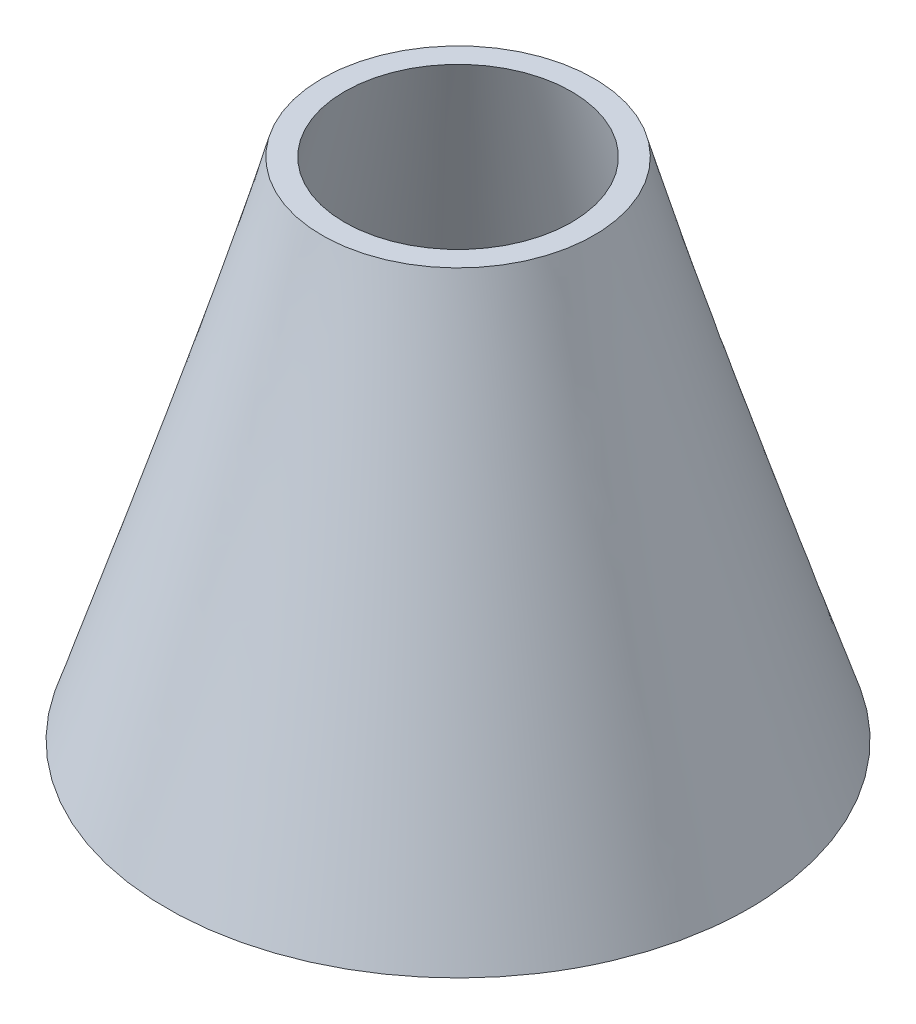
ISO-10303-21;
HEADER;
FILE_DESCRIPTION(('STEP AP214'),'2;1');
FILE_NAME('part.step','',(''),(''),'','','');
FILE_SCHEMA(('AUTOMOTIVE_DESIGN { 1 0 10303 214 1 1 1 1 }'));
ENDSEC;
DATA;
#1=APPLICATION_CONTEXT('core data for automotive mechanical design processes');
#2=APPLICATION_PROTOCOL_DEFINITION('international standard','automotive_design',2000,#1);
#3=PRODUCT_CONTEXT('',#1,'mechanical');
#4=PRODUCT('Part','Part','',(#3));
#5=PRODUCT_RELATED_PRODUCT_CATEGORY('part','',(#4));
#6=PRODUCT_DEFINITION_FORMATION('','',#4);
#7=PRODUCT_DEFINITION_CONTEXT('part definition',#1,'design');
#8=PRODUCT_DEFINITION('design','',#6,#7);
#9=PRODUCT_DEFINITION_SHAPE('','',#8);
#10=(LENGTH_UNIT() NAMED_UNIT(*) SI_UNIT(.MILLI.,.METRE.));
#11=(NAMED_UNIT(*) PLANE_ANGLE_UNIT() SI_UNIT($,.RADIAN.));
#12=(NAMED_UNIT(*) SI_UNIT($,.STERADIAN.) SOLID_ANGLE_UNIT());
#13=UNCERTAINTY_MEASURE_WITH_UNIT(LENGTH_MEASURE(1.E-05),#10,'distance_accuracy_value','');
#14=(GEOMETRIC_REPRESENTATION_CONTEXT(3) GLOBAL_UNCERTAINTY_ASSIGNED_CONTEXT((#13)) GLOBAL_UNIT_ASSIGNED_CONTEXT((#10,
#11,#12)) REPRESENTATION_CONTEXT('',''));
#15=CARTESIAN_POINT('',(0.,0.,0.));
#16=DIRECTION('',(0.,0.,1.));
#17=DIRECTION('',(1.,0.,0.));
#18=AXIS2_PLACEMENT_3D('',#15,#16,#17);
#19=CARTESIAN_POINT('',(0.,65.,0.));
#20=DIRECTION('',(0.,1.,0.));
#21=DIRECTION('',(0.,0.,1.));
#22=AXIS2_PLACEMENT_3D('',#19,#20,#21);
#23=PLANE('',#22);
#24=CARTESIAN_POINT('',(0.,65.,0.));
#25=DIRECTION('',(0.,1.,0.));
#26=DIRECTION('',(0.,0.,1.));
#27=AXIS2_PLACEMENT_3D('',#24,#25,#26);
#28=CIRCLE('',#27,14.5960170945373);
#29=CARTESIAN_POINT('',(0.,65.,14.5960170945373));
#30=VERTEX_POINT('',#29);
#31=EDGE_CURVE('E56',#30,#30,#28,.T.);
#32=ORIENTED_EDGE('',*,*,#31,.F.);
#33=EDGE_LOOP('',(#32));
#34=FACE_BOUND('',#33,.T.);
#35=CARTESIAN_POINT('',(0.,65.,0.));
#36=DIRECTION('',(0.,1.,0.));
#37=DIRECTION('',(0.,0.,1.));
#38=AXIS2_PLACEMENT_3D('',#35,#36,#37);
#39=CIRCLE('',#38,17.5);
#40=CARTESIAN_POINT('',(-14.2668592887615,65.,-10.1344326942696));
#41=VERTEX_POINT('',#40);
#42=EDGE_CURVE('E11',#41,#41,#39,.T.);
#43=ORIENTED_EDGE('',*,*,#42,.T.);
#44=EDGE_LOOP('',(#43));
#45=FACE_BOUND('',#44,.T.);
#46=ADVANCED_FACE('F41',(#34,#45),#23,.T.);
#47=CARTESIAN_POINT('',(0.,0.,0.));
#48=DIRECTION('',(0.,1.,0.));
#49=DIRECTION('',(0.,0.,1.));
#50=AXIS2_PLACEMENT_3D('',#47,#48,#49);
#51=PLANE('',#50);
#52=CARTESIAN_POINT('',(0.,0.,0.));
#53=DIRECTION('',(0.,-1.,0.));
#54=DIRECTION('',(0.,0.,-1.));
#55=AXIS2_PLACEMENT_3D('',#52,#53,#54);
#56=CIRCLE('',#55,32.5);
#57=CARTESIAN_POINT('',(0.,0.,-32.5));
#58=VERTEX_POINT('',#57);
#59=EDGE_CURVE('E120',#58,#58,#56,.T.);
#60=ORIENTED_EDGE('',*,*,#59,.F.);
#61=EDGE_LOOP('',(#60));
#62=FACE_BOUND('',#61,.T.);
#63=CARTESIAN_POINT('',(0.,0.,0.));
#64=DIRECTION('',(0.,1.,0.));
#65=DIRECTION('',(0.,0.,1.));
#66=AXIS2_PLACEMENT_3D('',#63,#64,#65);
#67=CIRCLE('',#66,37.5);
#68=CARTESIAN_POINT('',(-36.2140747356105,0.,-9.73605623667082));
#69=VERTEX_POINT('',#68);
#70=EDGE_CURVE('E50',#69,#69,#67,.T.);
#71=ORIENTED_EDGE('',*,*,#70,.F.);
#72=EDGE_LOOP('',(#71));
#73=FACE_BOUND('',#72,.T.);
#74=ADVANCED_FACE('F75',(#62,#73),#51,.F.);
#75=CARTESIAN_POINT('',(-36.2140747356105,0.,-9.73605623667082));
#76=CARTESIAN_POINT('',(-14.2668592887615,65.,-10.1344326942696));
#77=CARTESIAN_POINT('',(-55.6861872089521,0.,62.6920932345502));
#78=CARTESIAN_POINT('',(-34.5357246773007,65.,18.3992858832533));
#79=CARTESIAN_POINT('',(16.7419622622689,0.,82.1642057078918));
#80=CARTESIAN_POINT('',(-6.00200609977778,65.,38.6681512717925));
#81=CARTESIAN_POINT('',(36.2140747356105,0.,9.73605623667081));
#82=CARTESIAN_POINT('',(14.2668592887615,65.,10.1344326942696));
#83=CARTESIAN_POINT('',(55.6861872089521,0.,-62.6920932345502));
#84=CARTESIAN_POINT('',(34.5357246773007,65.,-18.3992858832533));
#85=CARTESIAN_POINT('',(-16.7419622622689,0.,-82.1642057078918));
#86=CARTESIAN_POINT('',(6.00200609977778,65.,-38.6681512717925));
#87=CARTESIAN_POINT('',(-36.2140747356105,0.,-9.73605623667082));
#88=CARTESIAN_POINT('',(-14.2668592887615,65.,-10.1344326942696));
#89=(BOUNDED_SURFACE() B_SPLINE_SURFACE(3,1,((#75,#76),(#77,#78),(#79,#80),(#81,#82),(#83,#84),
(#85,#86),(#87,#88)),.UNSPECIFIED.,.T.,.F.,.F.) B_SPLINE_SURFACE_WITH_KNOTS((4,3,4),(2,2),(0.,
0.5,1.),(0.,1.),.UNSPECIFIED.) GEOMETRIC_REPRESENTATION_ITEM() RATIONAL_B_SPLINE_SURFACE(((1.,
1.),(0.333333333333333,0.333333333333333),(0.333333333333333,0.333333333333333),(1.,1.),
(0.333333333333333,0.333333333333333),(0.333333333333333,0.333333333333333),(1.,1.))) REPRESENTATION_ITEM('') SURFACE());
#90=CARTESIAN_POINT('',(-36.2140747356105,0.,-9.73605623667082));
#91=CARTESIAN_POINT('',(-35.9854579080392,0.677083333333333,-9.74020599143747));
#92=CARTESIAN_POINT('',(-35.7568410804678,1.35416666666667,-9.74435574620413));
#93=CARTESIAN_POINT('',(-35.2996074253251,2.70833333333333,-9.75265525573743));
#94=CARTESIAN_POINT('',(-35.0709905977538,3.38541666666667,-9.75680501050409));
#95=CARTESIAN_POINT('',(-34.6137569426111,4.73958333333333,-9.7651045200374));
#96=CARTESIAN_POINT('',(-34.3851401150398,5.41666666666667,-9.76925427480405));
#97=CARTESIAN_POINT('',(-33.9279064598971,6.77083333333333,-9.77755378433736));
#98=CARTESIAN_POINT('',(-33.6992896323257,7.44791666666667,-9.78170353910402));
#99=CARTESIAN_POINT('',(-33.242055977183,8.80208333333333,-9.79000304863732));
#100=CARTESIAN_POINT('',(-33.0134391496117,9.47916666666667,-9.79415280340398));
#101=CARTESIAN_POINT('',(-32.556205494469,10.8333333333333,-9.80245231293729));
#102=CARTESIAN_POINT('',(-32.3275886668977,11.5104166666667,-9.80660206770394));
#103=CARTESIAN_POINT('',(-31.870355011755,12.8645833333333,-9.81490157723725));
#104=CARTESIAN_POINT('',(-31.6417381841836,13.5416666666667,-9.8190513320039));
#105=CARTESIAN_POINT('',(-31.1845045290409,14.8958333333333,-9.82735084153721));
#106=CARTESIAN_POINT('',(-30.9558877014696,15.5729166666667,-9.83150059630387));
#107=CARTESIAN_POINT('',(-30.4986540463269,16.9270833333333,-9.83980010583717));
#108=CARTESIAN_POINT('',(-30.2700372187556,17.6041666666667,-9.84394986060383));
#109=CARTESIAN_POINT('',(-29.8128035636129,18.9583333333333,-9.85224937013714));
#110=CARTESIAN_POINT('',(-29.5841867360415,19.6354166666667,-9.85639912490379));
#111=CARTESIAN_POINT('',(-29.1269530808988,20.9895833333333,-9.8646986344371));
#112=CARTESIAN_POINT('',(-28.8983362533275,21.6666666666667,-9.86884838920375));
#113=CARTESIAN_POINT('',(-28.4411025981848,23.0208333333333,-9.87714789873706));
#114=CARTESIAN_POINT('',(-28.2124857706135,23.6979166666667,-9.88129765350372));
#115=CARTESIAN_POINT('',(-27.7552521154708,25.0520833333333,-9.88959716303702));
#116=CARTESIAN_POINT('',(-27.5266352878994,25.7291666666667,-9.89374691780368));
#117=CARTESIAN_POINT('',(-27.0694016327567,27.0833333333333,-9.90204642733699));
#118=CARTESIAN_POINT('',(-26.8407848051854,27.7604166666667,-9.90619618210364));
#119=CARTESIAN_POINT('',(-26.3835511500427,29.1145833333333,-9.91449569163695));
#120=CARTESIAN_POINT('',(-26.1549343224714,29.7916666666667,-9.91864544640361));
#121=CARTESIAN_POINT('',(-25.6977006673287,31.1458333333333,-9.92694495593691));
#122=CARTESIAN_POINT('',(-25.4690838397573,31.8229166666667,-9.93109471070357));
#123=CARTESIAN_POINT('',(-25.0118501846146,33.1770833333333,-9.93939422023687));
#124=CARTESIAN_POINT('',(-24.7832333570433,33.8541666666667,-9.94354397500353));
#125=CARTESIAN_POINT('',(-24.3259997019006,35.2083333333333,-9.95184348453684));
#126=CARTESIAN_POINT('',(-24.0973828743293,35.8854166666667,-9.95599323930349));
#127=CARTESIAN_POINT('',(-23.6401492191866,37.2395833333333,-9.9642927488368));
#128=CARTESIAN_POINT('',(-23.4115323916152,37.9166666666667,-9.96844250360346));
#129=CARTESIAN_POINT('',(-22.9542987364725,39.2708333333333,-9.97674201313676));
#130=CARTESIAN_POINT('',(-22.7256819089012,39.9479166666667,-9.98089176790342));
#131=CARTESIAN_POINT('',(-22.2684482537585,41.3020833333333,-9.98919127743673));
#132=CARTESIAN_POINT('',(-22.0398314261872,41.9791666666667,-9.99334103220338));
#133=CARTESIAN_POINT('',(-21.5825977710445,43.3333333333333,-10.0016405417367));
#134=CARTESIAN_POINT('',(-21.3539809434731,44.0104166666667,-10.0057902965033));
#135=CARTESIAN_POINT('',(-20.8967472883304,45.3645833333333,-10.0140898060367));
#136=CARTESIAN_POINT('',(-20.6681304607591,46.0416666666667,-10.0182395608033));
#137=CARTESIAN_POINT('',(-20.2108968056164,47.3958333333333,-10.0265390703366));
#138=CARTESIAN_POINT('',(-19.9822799780451,48.0729166666667,-10.0306888251033));
#139=CARTESIAN_POINT('',(-19.5250463229024,49.4270833333333,-10.0389883346366));
#140=CARTESIAN_POINT('',(-19.296429495331,50.1041666666667,-10.0431380894032));
#141=CARTESIAN_POINT('',(-18.8391958401883,51.4583333333333,-10.0514375989365));
#142=CARTESIAN_POINT('',(-18.610579012617,52.1354166666667,-10.0555873537032));
#143=CARTESIAN_POINT('',(-18.1533453574743,53.4895833333333,-10.0638868632365));
#144=CARTESIAN_POINT('',(-17.924728529903,54.1666666666667,-10.0680366180032));
#145=CARTESIAN_POINT('',(-17.4674948747603,55.5208333333333,-10.0763361275365));
#146=CARTESIAN_POINT('',(-17.2388780471889,56.1979166666667,-10.0804858823031));
#147=CARTESIAN_POINT('',(-16.7816443920462,57.5520833333333,-10.0887853918364));
#148=CARTESIAN_POINT('',(-16.5530275644749,58.2291666666667,-10.0929351466031));
#149=CARTESIAN_POINT('',(-16.0957939093322,59.5833333333333,-10.1012346561364));
#150=CARTESIAN_POINT('',(-15.8671770817609,60.2604166666667,-10.105384410903));
#151=CARTESIAN_POINT('',(-15.4099434266182,61.6145833333333,-10.1136839204364));
#152=CARTESIAN_POINT('',(-15.1813265990468,62.2916666666667,-10.117833675203));
#153=CARTESIAN_POINT('',(-14.7240929439041,63.6458333333333,-10.1261331847363));
#154=CARTESIAN_POINT('',(-14.4954761163328,64.3229166666667,-10.130282939503));
#155=CARTESIAN_POINT('',(-14.2668592887615,65.,-10.1344326942696));
#156=B_SPLINE_CURVE_WITH_KNOTS('',3,(#90,#91,#92,#93,#94,#95,#96,#97,#98,#99,#100,#101,#102,
#103,#104,#105,#106,#107,#108,#109,#110,#111,#112,#113,#114,#115,#116,#117,#118,#119,#120,#121,
#122,#123,#124,#125,#126,#127,#128,#129,#130,#131,#132,#133,#134,#135,#136,#137,#138,#139,#140,
#141,#142,#143,#144,#145,#146,#147,#148,#149,#150,#151,#152,#153,#154,#155),.UNSPECIFIED.,.F.,
.F.,(4,2,2,2,2,2,2,2,2,2,2,2,2,2,2,2,2,2,2,2,2,2,2,2,2,2,2,2,2,2,2,2,4),(0.,2.14395019329291,
4.28790038658581,6.43185057987871,8.57580077317162,10.7197509664645,12.8637011597574,
15.0076513530503,17.1516015463432,19.2955517396361,21.439501932929,23.583452126222,
25.7274023195149,27.8713525128078,30.0153027061007,32.1592528993936,34.3032030926865,
36.4471532859794,38.5911034792723,40.7350536725652,42.8790038658581,45.022954059151,
47.1669042524439,49.3108544457368,51.4548046390297,53.5987548323226,55.7427050256155,
57.8866552189084,60.0306054122013,62.1745556054942,64.3185057987871,66.46245599208,
68.6064061853729),.UNSPECIFIED.);
#157=EDGE_CURVE('BSEAM84',#69,#41,#156,.T.);
#158=ORIENTED_EDGE('',*,*,#70,.T.);
#159=ORIENTED_EDGE('',*,*,#42,.F.);
#160=ORIENTED_EDGE('',*,*,#157,.T.);
#161=ORIENTED_EDGE('',*,*,#157,.F.);
#162=EDGE_LOOP('',(#158,#160,#159,#161));
#163=FACE_BOUND('',#162,.T.);
#164=ADVANCED_FACE('F84',(#163),#89,.T.);
#165=CARTESIAN_POINT('',(0.,0.,0.));
#166=DIRECTION('',(0.,-1.,0.));
#167=DIRECTION('',(0.,0.,-1.));
#168=AXIS2_PLACEMENT_3D('',#165,#166,#167);
#169=CONICAL_SURFACE('',#168,32.5,0.268780704807127);
#170=ORIENTED_EDGE('',*,*,#31,.T.);
#171=EDGE_LOOP('',(#170));
#172=FACE_BOUND('',#171,.T.);
#173=ORIENTED_EDGE('',*,*,#59,.T.);
#174=EDGE_LOOP('',(#173));
#175=FACE_BOUND('',#174,.T.);
#176=ADVANCED_FACE('F86',(#172,#175),#169,.F.);
#177=CLOSED_SHELL('',(#46,#74,#164,#176));
#178=MANIFOLD_SOLID_BREP('B2',#177);
#179=ADVANCED_BREP_SHAPE_REPRESENTATION('',(#18,#178),#14);
#180=SHAPE_DEFINITION_REPRESENTATION(#9,#179);
ENDSEC;
END-ISO-10303-21;
